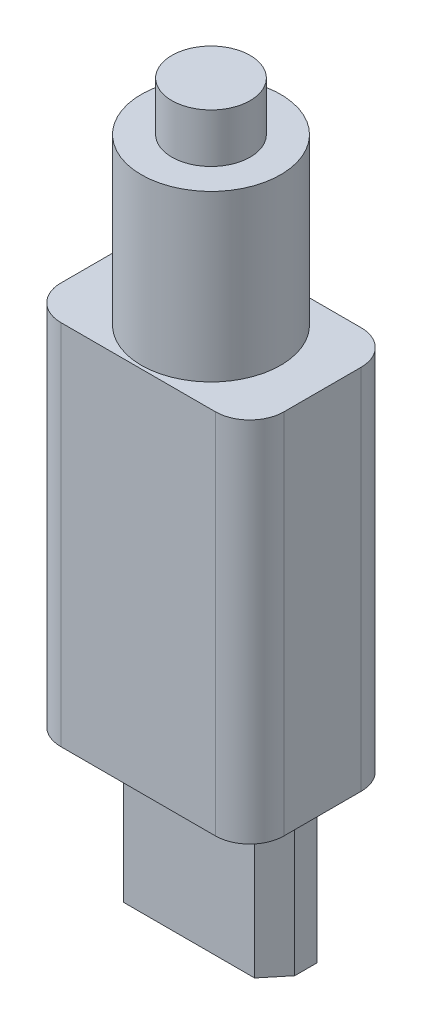
ISO-10303-21;
HEADER;
FILE_DESCRIPTION(('STEP AP214'),'2;1');
FILE_NAME('part.step','',(''),(''),'','','');
FILE_SCHEMA(('AUTOMOTIVE_DESIGN { 1 0 10303 214 1 1 1 1 }'));
ENDSEC;
DATA;
#1=APPLICATION_CONTEXT('core data for automotive mechanical design processes');
#2=APPLICATION_PROTOCOL_DEFINITION('international standard','automotive_design',2000,#1);
#3=PRODUCT_CONTEXT('',#1,'mechanical');
#4=PRODUCT('Part','Part','',(#3));
#5=PRODUCT_RELATED_PRODUCT_CATEGORY('part','',(#4));
#6=PRODUCT_DEFINITION_FORMATION('','',#4);
#7=PRODUCT_DEFINITION_CONTEXT('part definition',#1,'design');
#8=PRODUCT_DEFINITION('design','',#6,#7);
#9=PRODUCT_DEFINITION_SHAPE('','',#8);
#10=(LENGTH_UNIT() NAMED_UNIT(*) SI_UNIT(.MILLI.,.METRE.));
#11=(NAMED_UNIT(*) PLANE_ANGLE_UNIT() SI_UNIT($,.RADIAN.));
#12=(NAMED_UNIT(*) SI_UNIT($,.STERADIAN.) SOLID_ANGLE_UNIT());
#13=UNCERTAINTY_MEASURE_WITH_UNIT(LENGTH_MEASURE(1.E-05),#10,'distance_accuracy_value','');
#14=(GEOMETRIC_REPRESENTATION_CONTEXT(3) GLOBAL_UNCERTAINTY_ASSIGNED_CONTEXT((#13)) GLOBAL_UNIT_ASSIGNED_CONTEXT((#10,
#11,#12)) REPRESENTATION_CONTEXT('',''));
#15=CARTESIAN_POINT('',(0.,0.,0.));
#16=DIRECTION('',(0.,0.,1.));
#17=DIRECTION('',(1.,0.,0.));
#18=AXIS2_PLACEMENT_3D('',#15,#16,#17);
#19=CARTESIAN_POINT('',(3.42,6.3,0.));
#20=DIRECTION('',(-1.,0.,0.));
#21=DIRECTION('',(0.,0.,1.));
#22=AXIS2_PLACEMENT_3D('',#19,#20,#21);
#23=PLANE('',#22);
#24=DIRECTION('',(0.,0.,-1.));
#25=VECTOR('',#24,1.);
#26=CARTESIAN_POINT('',(3.42,0.,0.));
#27=LINE('',#26,#25);
#28=CARTESIAN_POINT('',(3.42,0.,0.));
#29=VERTEX_POINT('',#28);
#30=CARTESIAN_POINT('',(3.42,0.,-0.9));
#31=VERTEX_POINT('',#30);
#32=EDGE_CURVE('E171',#29,#31,#27,.T.);
#33=ORIENTED_EDGE('',*,*,#32,.T.);
#34=DIRECTION('',(0.,-1.,0.));
#35=VECTOR('',#34,1.);
#36=CARTESIAN_POINT('',(3.42,6.3,-0.9));
#37=LINE('',#36,#35);
#38=CARTESIAN_POINT('',(3.42,6.3,-0.9));
#39=VERTEX_POINT('',#38);
#40=EDGE_CURVE('E145',#39,#31,#37,.T.);
#41=ORIENTED_EDGE('',*,*,#40,.F.);
#42=DIRECTION('',(0.,0.,-1.));
#43=VECTOR('',#42,1.);
#44=CARTESIAN_POINT('',(3.42,6.3,0.));
#45=LINE('',#44,#43);
#46=CARTESIAN_POINT('',(3.42,6.3,0.));
#47=VERTEX_POINT('',#46);
#48=EDGE_CURVE('E139',#47,#39,#45,.T.);
#49=ORIENTED_EDGE('',*,*,#48,.F.);
#50=DIRECTION('',(0.,-1.,0.));
#51=VECTOR('',#50,1.);
#52=CARTESIAN_POINT('',(3.42,6.3,0.));
#53=LINE('',#52,#51);
#54=EDGE_CURVE('E142',#47,#29,#53,.T.);
#55=ORIENTED_EDGE('',*,*,#54,.T.);
#56=EDGE_LOOP('',(#33,#41,#49,#55));
#57=FACE_BOUND('',#56,.T.);
#58=ADVANCED_FACE('F33',(#57),#23,.F.);
#59=CARTESIAN_POINT('',(-3.42,6.3,-0.9));
#60=DIRECTION('',(0.,0.,1.));
#61=DIRECTION('',(1.,0.,0.));
#62=AXIS2_PLACEMENT_3D('',#59,#60,#61);
#63=PLANE('',#62);
#64=DIRECTION('',(-1.,0.,0.));
#65=VECTOR('',#64,1.);
#66=CARTESIAN_POINT('',(-3.42,0.,-0.9));
#67=LINE('',#66,#65);
#68=CARTESIAN_POINT('',(-3.42,0.,-0.9));
#69=VERTEX_POINT('',#68);
#70=EDGE_CURVE('E173',#31,#69,#67,.T.);
#71=ORIENTED_EDGE('',*,*,#70,.T.);
#72=DIRECTION('',(0.,-1.,0.));
#73=VECTOR('',#72,1.);
#74=CARTESIAN_POINT('',(-3.42,6.3,-0.9));
#75=LINE('',#74,#73);
#76=CARTESIAN_POINT('',(-3.42,6.3,-0.9));
#77=VERTEX_POINT('',#76);
#78=EDGE_CURVE('E190',#77,#69,#75,.T.);
#79=ORIENTED_EDGE('',*,*,#78,.F.);
#80=DIRECTION('',(-1.,0.,0.));
#81=VECTOR('',#80,1.);
#82=CARTESIAN_POINT('',(-3.42,6.3,-0.9));
#83=LINE('',#82,#81);
#84=EDGE_CURVE('E149',#39,#77,#83,.T.);
#85=ORIENTED_EDGE('',*,*,#84,.F.);
#86=ORIENTED_EDGE('',*,*,#40,.T.);
#87=EDGE_LOOP('',(#71,#79,#85,#86));
#88=FACE_BOUND('',#87,.T.);
#89=ADVANCED_FACE('F268',(#88),#63,.F.);
#90=CARTESIAN_POINT('',(-3.42,6.3,0.));
#91=DIRECTION('',(1.,0.,0.));
#92=DIRECTION('',(0.,0.,-1.));
#93=AXIS2_PLACEMENT_3D('',#90,#91,#92);
#94=PLANE('',#93);
#95=DIRECTION('',(0.,0.,1.));
#96=VECTOR('',#95,1.);
#97=CARTESIAN_POINT('',(-3.42,0.,0.));
#98=LINE('',#97,#96);
#99=CARTESIAN_POINT('',(-3.42,0.,0.));
#100=VERTEX_POINT('',#99);
#101=EDGE_CURVE('E176',#69,#100,#98,.T.);
#102=ORIENTED_EDGE('',*,*,#101,.T.);
#103=DIRECTION('',(0.,-1.,0.));
#104=VECTOR('',#103,1.);
#105=CARTESIAN_POINT('',(-3.42,6.3,0.));
#106=LINE('',#105,#104);
#107=CARTESIAN_POINT('',(-3.42,6.3,0.));
#108=VERTEX_POINT('',#107);
#109=EDGE_CURVE('E187',#108,#100,#106,.T.);
#110=ORIENTED_EDGE('',*,*,#109,.F.);
#111=DIRECTION('',(0.,0.,1.));
#112=VECTOR('',#111,1.);
#113=CARTESIAN_POINT('',(-3.42,6.3,0.));
#114=LINE('',#113,#112);
#115=EDGE_CURVE('E254',#77,#108,#114,.T.);
#116=ORIENTED_EDGE('',*,*,#115,.F.);
#117=ORIENTED_EDGE('',*,*,#78,.T.);
#118=EDGE_LOOP('',(#102,#110,#116,#117));
#119=FACE_BOUND('',#118,.T.);
#120=ADVANCED_FACE('F270',(#119),#94,.F.);
#121=CARTESIAN_POINT('',(-3.42,6.3,0.));
#122=DIRECTION('',(0.772425485990959,0.,-0.635105399592565));
#123=DIRECTION('',(-0.635105399592565,0.,-0.772425485990958));
#124=AXIS2_PLACEMENT_3D('',#121,#122,#123);
#125=PLANE('',#124);
#126=DIRECTION('',(0.635105399592565,0.,0.772425485990958));
#127=VECTOR('',#126,1.);
#128=CARTESIAN_POINT('',(-3.42,0.,0.));
#129=LINE('',#128,#127);
#130=CARTESIAN_POINT('',(-2.68,0.,0.9));
#131=VERTEX_POINT('',#130);
#132=EDGE_CURVE('E178',#100,#131,#129,.T.);
#133=ORIENTED_EDGE('',*,*,#132,.T.);
#134=DIRECTION('',(0.,-1.,0.));
#135=VECTOR('',#134,1.);
#136=CARTESIAN_POINT('',(-2.68,6.3,0.9));
#137=LINE('',#136,#135);
#138=CARTESIAN_POINT('',(-2.68,6.3,0.9));
#139=VERTEX_POINT('',#138);
#140=EDGE_CURVE('E184',#139,#131,#137,.T.);
#141=ORIENTED_EDGE('',*,*,#140,.F.);
#142=DIRECTION('',(0.635105399592565,0.,0.772425485990958));
#143=VECTOR('',#142,1.);
#144=CARTESIAN_POINT('',(-3.42,6.3,0.));
#145=LINE('',#144,#143);
#146=EDGE_CURVE('E167',#108,#139,#145,.T.);
#147=ORIENTED_EDGE('',*,*,#146,.F.);
#148=ORIENTED_EDGE('',*,*,#109,.T.);
#149=EDGE_LOOP('',(#133,#141,#147,#148));
#150=FACE_BOUND('',#149,.T.);
#151=ADVANCED_FACE('F259',(#150),#125,.F.);
#152=CARTESIAN_POINT('',(-2.68,6.3,0.9));
#153=DIRECTION('',(0.,0.,-1.));
#154=DIRECTION('',(-1.,0.,0.));
#155=AXIS2_PLACEMENT_3D('',#152,#153,#154);
#156=PLANE('',#155);
#157=DIRECTION('',(1.,0.,0.));
#158=VECTOR('',#157,1.);
#159=CARTESIAN_POINT('',(-2.68,0.,0.9));
#160=LINE('',#159,#158);
#161=CARTESIAN_POINT('',(2.68,0.,0.899999999999999));
#162=VERTEX_POINT('',#161);
#163=EDGE_CURVE('E180',#131,#162,#160,.T.);
#164=ORIENTED_EDGE('',*,*,#163,.T.);
#165=DIRECTION('',(0.,-1.,0.));
#166=VECTOR('',#165,1.);
#167=CARTESIAN_POINT('',(2.68,6.3,0.899999999999999));
#168=LINE('',#167,#166);
#169=CARTESIAN_POINT('',(2.68,6.3,0.899999999999999));
#170=VERTEX_POINT('',#169);
#171=EDGE_CURVE('E159',#170,#162,#168,.T.);
#172=ORIENTED_EDGE('',*,*,#171,.F.);
#173=DIRECTION('',(1.,0.,0.));
#174=VECTOR('',#173,1.);
#175=CARTESIAN_POINT('',(-2.68,6.3,0.9));
#176=LINE('',#175,#174);
#177=EDGE_CURVE('E165',#139,#170,#176,.T.);
#178=ORIENTED_EDGE('',*,*,#177,.F.);
#179=ORIENTED_EDGE('',*,*,#140,.T.);
#180=EDGE_LOOP('',(#164,#172,#178,#179));
#181=FACE_BOUND('',#180,.T.);
#182=ADVANCED_FACE('F263',(#181),#156,.F.);
#183=CARTESIAN_POINT('',(2.68,6.3,0.899999999999999));
#184=DIRECTION('',(-0.772425485990958,0.,-0.635105399592566));
#185=DIRECTION('',(-0.635105399592566,0.,0.772425485990958));
#186=AXIS2_PLACEMENT_3D('',#183,#184,#185);
#187=PLANE('',#186);
#188=DIRECTION('',(0.635105399592566,0.,-0.772425485990958));
#189=VECTOR('',#188,1.);
#190=CARTESIAN_POINT('',(2.68,0.,0.899999999999999));
#191=LINE('',#190,#189);
#192=EDGE_CURVE('E150',#162,#29,#191,.T.);
#193=ORIENTED_EDGE('',*,*,#192,.T.);
#194=ORIENTED_EDGE('',*,*,#54,.F.);
#195=DIRECTION('',(0.635105399592566,0.,-0.772425485990958));
#196=VECTOR('',#195,1.);
#197=CARTESIAN_POINT('',(2.68,6.3,0.899999999999999));
#198=LINE('',#197,#196);
#199=EDGE_CURVE('E156',#170,#47,#198,.T.);
#200=ORIENTED_EDGE('',*,*,#199,.F.);
#201=ORIENTED_EDGE('',*,*,#171,.T.);
#202=EDGE_LOOP('',(#193,#194,#200,#201));
#203=FACE_BOUND('',#202,.T.);
#204=ADVANCED_FACE('F154',(#203),#187,.F.);
#205=CARTESIAN_POINT('',(0.,0.,0.));
#206=DIRECTION('',(0.,-1.,0.));
#207=DIRECTION('',(0.,0.,-1.));
#208=AXIS2_PLACEMENT_3D('',#205,#206,#207);
#209=PLANE('',#208);
#210=ORIENTED_EDGE('',*,*,#32,.F.);
#211=ORIENTED_EDGE('',*,*,#192,.F.);
#212=ORIENTED_EDGE('',*,*,#163,.F.);
#213=ORIENTED_EDGE('',*,*,#132,.F.);
#214=ORIENTED_EDGE('',*,*,#101,.F.);
#215=ORIENTED_EDGE('',*,*,#70,.F.);
#216=EDGE_LOOP('',(#210,#211,#212,#213,#214,#215));
#217=FACE_BOUND('',#216,.T.);
#218=ADVANCED_FACE('F265',(#217),#209,.T.);
#219=CARTESIAN_POINT('',(4.555,21.3,2.975));
#220=DIRECTION('',(-1.,0.,0.));
#221=DIRECTION('',(0.,0.,1.));
#222=AXIS2_PLACEMENT_3D('',#219,#220,#221);
#223=PLANE('',#222);
#224=DIRECTION('',(0.,0.,-1.));
#225=VECTOR('',#224,1.);
#226=CARTESIAN_POINT('',(4.555,6.3,2.975));
#227=LINE('',#226,#225);
#228=CARTESIAN_POINT('',(4.555,6.3,1.575));
#229=VERTEX_POINT('',#228);
#230=CARTESIAN_POINT('',(4.555,6.3,-1.575));
#231=VERTEX_POINT('',#230);
#232=EDGE_CURVE('E243',#229,#231,#227,.T.);
#233=ORIENTED_EDGE('',*,*,#232,.T.);
#234=DIRECTION('',(0.,-1.,0.));
#235=VECTOR('',#234,1.);
#236=CARTESIAN_POINT('',(4.555,21.3,-1.575));
#237=LINE('',#236,#235);
#238=CARTESIAN_POINT('',(4.555,21.3,-1.575));
#239=VERTEX_POINT('',#238);
#240=EDGE_CURVE('E210',#231,#239,#237,.F.);
#241=ORIENTED_EDGE('',*,*,#240,.T.);
#242=DIRECTION('',(0.,0.,-1.));
#243=VECTOR('',#242,1.);
#244=CARTESIAN_POINT('',(4.555,21.3,2.975));
#245=LINE('',#244,#243);
#246=CARTESIAN_POINT('',(4.555,21.3,1.575));
#247=VERTEX_POINT('',#246);
#248=EDGE_CURVE('E233',#247,#239,#245,.T.);
#249=ORIENTED_EDGE('',*,*,#248,.F.);
#250=DIRECTION('',(0.,-1.,0.));
#251=VECTOR('',#250,1.);
#252=CARTESIAN_POINT('',(4.555,21.3,1.575));
#253=LINE('',#252,#251);
#254=EDGE_CURVE('E207',#247,#229,#253,.T.);
#255=ORIENTED_EDGE('',*,*,#254,.T.);
#256=EDGE_LOOP('',(#233,#241,#249,#255));
#257=FACE_BOUND('',#256,.T.);
#258=ADVANCED_FACE('F316',(#257),#223,.F.);
#259=CARTESIAN_POINT('',(-4.555,21.3,-2.975));
#260=DIRECTION('',(0.,0.,1.));
#261=DIRECTION('',(1.,0.,0.));
#262=AXIS2_PLACEMENT_3D('',#259,#260,#261);
#263=PLANE('',#262);
#264=DIRECTION('',(-1.,0.,0.));
#265=VECTOR('',#264,1.);
#266=CARTESIAN_POINT('',(-4.555,21.3,-2.975));
#267=LINE('',#266,#265);
#268=CARTESIAN_POINT('',(3.155,21.3,-2.975));
#269=VERTEX_POINT('',#268);
#270=CARTESIAN_POINT('',(-3.155,21.3,-2.975));
#271=VERTEX_POINT('',#270);
#272=EDGE_CURVE('E236',#269,#271,#267,.T.);
#273=ORIENTED_EDGE('',*,*,#272,.F.);
#274=DIRECTION('',(0.,-1.,0.));
#275=VECTOR('',#274,1.);
#276=CARTESIAN_POINT('',(3.155,21.3,-2.975));
#277=LINE('',#276,#275);
#278=CARTESIAN_POINT('',(3.155,6.3,-2.975));
#279=VERTEX_POINT('',#278);
#280=EDGE_CURVE('E196',#269,#279,#277,.T.);
#281=ORIENTED_EDGE('',*,*,#280,.T.);
#282=DIRECTION('',(-1.,0.,0.));
#283=VECTOR('',#282,1.);
#284=CARTESIAN_POINT('',(-4.555,6.3,-2.975));
#285=LINE('',#284,#283);
#286=CARTESIAN_POINT('',(-3.155,6.3,-2.975));
#287=VERTEX_POINT('',#286);
#288=EDGE_CURVE('E246',#279,#287,#285,.T.);
#289=ORIENTED_EDGE('',*,*,#288,.T.);
#290=DIRECTION('',(0.,-1.,0.));
#291=VECTOR('',#290,1.);
#292=CARTESIAN_POINT('',(-3.155,21.3,-2.975));
#293=LINE('',#292,#291);
#294=EDGE_CURVE('E194',#287,#271,#293,.F.);
#295=ORIENTED_EDGE('',*,*,#294,.T.);
#296=EDGE_LOOP('',(#273,#281,#289,#295));
#297=FACE_BOUND('',#296,.T.);
#298=ADVANCED_FACE('F310',(#297),#263,.F.);
#299=CARTESIAN_POINT('',(-4.555,21.3,2.975));
#300=DIRECTION('',(1.,0.,0.));
#301=DIRECTION('',(0.,0.,-1.));
#302=AXIS2_PLACEMENT_3D('',#299,#300,#301);
#303=PLANE('',#302);
#304=DIRECTION('',(0.,0.,1.));
#305=VECTOR('',#304,1.);
#306=CARTESIAN_POINT('',(-4.555,21.3,2.975));
#307=LINE('',#306,#305);
#308=CARTESIAN_POINT('',(-4.555,21.3,-1.575));
#309=VERTEX_POINT('',#308);
#310=CARTESIAN_POINT('',(-4.555,21.3,1.575));
#311=VERTEX_POINT('',#310);
#312=EDGE_CURVE('E240',#309,#311,#307,.T.);
#313=ORIENTED_EDGE('',*,*,#312,.F.);
#314=DIRECTION('',(0.,-1.,0.));
#315=VECTOR('',#314,1.);
#316=CARTESIAN_POINT('',(-4.555,21.3,-1.575));
#317=LINE('',#316,#315);
#318=CARTESIAN_POINT('',(-4.555,6.3,-1.575));
#319=VERTEX_POINT('',#318);
#320=EDGE_CURVE('E221',#309,#319,#317,.T.);
#321=ORIENTED_EDGE('',*,*,#320,.T.);
#322=DIRECTION('',(0.,0.,1.));
#323=VECTOR('',#322,1.);
#324=CARTESIAN_POINT('',(-4.555,6.3,2.975));
#325=LINE('',#324,#323);
#326=CARTESIAN_POINT('',(-4.555,6.3,1.575));
#327=VERTEX_POINT('',#326);
#328=EDGE_CURVE('E249',#319,#327,#325,.T.);
#329=ORIENTED_EDGE('',*,*,#328,.T.);
#330=DIRECTION('',(0.,-1.,0.));
#331=VECTOR('',#330,1.);
#332=CARTESIAN_POINT('',(-4.555,21.3,1.575));
#333=LINE('',#332,#331);
#334=EDGE_CURVE('E219',#327,#311,#333,.F.);
#335=ORIENTED_EDGE('',*,*,#334,.T.);
#336=EDGE_LOOP('',(#313,#321,#329,#335));
#337=FACE_BOUND('',#336,.T.);
#338=ADVANCED_FACE('F304',(#337),#303,.F.);
#339=CARTESIAN_POINT('',(-4.555,21.3,2.975));
#340=DIRECTION('',(0.,0.,-1.));
#341=DIRECTION('',(-1.,0.,0.));
#342=AXIS2_PLACEMENT_3D('',#339,#340,#341);
#343=PLANE('',#342);
#344=DIRECTION('',(1.,0.,0.));
#345=VECTOR('',#344,1.);
#346=CARTESIAN_POINT('',(-4.555,21.3,2.975));
#347=LINE('',#346,#345);
#348=CARTESIAN_POINT('',(-3.155,21.3,2.975));
#349=VERTEX_POINT('',#348);
#350=CARTESIAN_POINT('',(3.155,21.3,2.975));
#351=VERTEX_POINT('',#350);
#352=EDGE_CURVE('E174',#349,#351,#347,.T.);
#353=ORIENTED_EDGE('',*,*,#352,.F.);
#354=DIRECTION('',(0.,-1.,0.));
#355=VECTOR('',#354,1.);
#356=CARTESIAN_POINT('',(-3.155,21.3,2.975));
#357=LINE('',#356,#355);
#358=CARTESIAN_POINT('',(-3.155,6.3,2.975));
#359=VERTEX_POINT('',#358);
#360=EDGE_CURVE('E37',#349,#359,#357,.T.);
#361=ORIENTED_EDGE('',*,*,#360,.T.);
#362=DIRECTION('',(1.,0.,0.));
#363=VECTOR('',#362,1.);
#364=CARTESIAN_POINT('',(-4.555,6.3,2.975));
#365=LINE('',#364,#363);
#366=CARTESIAN_POINT('',(3.155,6.3,2.975));
#367=VERTEX_POINT('',#366);
#368=EDGE_CURVE('E237',#359,#367,#365,.T.);
#369=ORIENTED_EDGE('',*,*,#368,.T.);
#370=DIRECTION('',(0.,-1.,0.));
#371=VECTOR('',#370,1.);
#372=CARTESIAN_POINT('',(3.155,21.3,2.975));
#373=LINE('',#372,#371);
#374=EDGE_CURVE('E50',#367,#351,#373,.F.);
#375=ORIENTED_EDGE('',*,*,#374,.T.);
#376=EDGE_LOOP('',(#353,#361,#369,#375));
#377=FACE_BOUND('',#376,.T.);
#378=ADVANCED_FACE('F320',(#377),#343,.F.);
#379=CARTESIAN_POINT('',(0.,21.3,0.));
#380=DIRECTION('',(0.,-1.,0.));
#381=DIRECTION('',(0.,0.,-1.));
#382=AXIS2_PLACEMENT_3D('',#379,#380,#381);
#383=PLANE('',#382);
#384=CARTESIAN_POINT('',(0.,21.3,0.));
#385=DIRECTION('',(0.,1.,0.));
#386=DIRECTION('',(0.,0.,1.));
#387=AXIS2_PLACEMENT_3D('',#384,#385,#386);
#388=CIRCLE('',#387,2.845);
#389=CARTESIAN_POINT('',(0.,21.3,2.845));
#390=VERTEX_POINT('',#389);
#391=EDGE_CURVE('E42',#390,#390,#388,.T.);
#392=ORIENTED_EDGE('',*,*,#391,.F.);
#393=EDGE_LOOP('',(#392));
#394=FACE_BOUND('',#393,.T.);
#395=ORIENTED_EDGE('',*,*,#248,.T.);
#396=CARTESIAN_POINT('',(3.155,21.3,-1.575));
#397=DIRECTION('',(0.,-1.,0.));
#398=DIRECTION('',(0.,0.,-1.));
#399=AXIS2_PLACEMENT_3D('',#396,#397,#398);
#400=CIRCLE('',#399,1.4);
#401=EDGE_CURVE('E217',#239,#269,#400,.F.);
#402=ORIENTED_EDGE('',*,*,#401,.T.);
#403=ORIENTED_EDGE('',*,*,#272,.T.);
#404=CARTESIAN_POINT('',(-3.155,21.3,-1.575));
#405=DIRECTION('',(0.,-1.,0.));
#406=DIRECTION('',(0.,0.,-1.));
#407=AXIS2_PLACEMENT_3D('',#404,#405,#406);
#408=CIRCLE('',#407,1.4);
#409=EDGE_CURVE('E215',#271,#309,#408,.F.);
#410=ORIENTED_EDGE('',*,*,#409,.T.);
#411=ORIENTED_EDGE('',*,*,#312,.T.);
#412=CARTESIAN_POINT('',(-3.155,21.3,1.575));
#413=DIRECTION('',(0.,-1.,0.));
#414=DIRECTION('',(0.,0.,-1.));
#415=AXIS2_PLACEMENT_3D('',#412,#413,#414);
#416=CIRCLE('',#415,1.4);
#417=EDGE_CURVE('E57',#311,#349,#416,.F.);
#418=ORIENTED_EDGE('',*,*,#417,.T.);
#419=ORIENTED_EDGE('',*,*,#352,.T.);
#420=CARTESIAN_POINT('',(3.155,21.3,1.575));
#421=DIRECTION('',(0.,-1.,0.));
#422=DIRECTION('',(0.,0.,-1.));
#423=AXIS2_PLACEMENT_3D('',#420,#421,#422);
#424=CIRCLE('',#423,1.4);
#425=EDGE_CURVE('E212',#351,#247,#424,.F.);
#426=ORIENTED_EDGE('',*,*,#425,.T.);
#427=EDGE_LOOP('',(#395,#402,#403,#410,#411,#418,#419,#426));
#428=FACE_BOUND('',#427,.T.);
#429=ADVANCED_FACE('F322',(#394,#428),#383,.F.);
#430=CARTESIAN_POINT('',(0.,6.3,0.));
#431=DIRECTION('',(0.,-1.,0.));
#432=DIRECTION('',(0.,0.,-1.));
#433=AXIS2_PLACEMENT_3D('',#430,#431,#432);
#434=PLANE('',#433);
#435=ORIENTED_EDGE('',*,*,#199,.T.);
#436=ORIENTED_EDGE('',*,*,#48,.T.);
#437=ORIENTED_EDGE('',*,*,#84,.T.);
#438=ORIENTED_EDGE('',*,*,#115,.T.);
#439=ORIENTED_EDGE('',*,*,#146,.T.);
#440=ORIENTED_EDGE('',*,*,#177,.T.);
#441=EDGE_LOOP('',(#435,#436,#437,#438,#439,#440));
#442=FACE_BOUND('',#441,.T.);
#443=ORIENTED_EDGE('',*,*,#288,.F.);
#444=CARTESIAN_POINT('',(3.155,6.3,-1.575));
#445=DIRECTION('',(0.,-1.,0.));
#446=DIRECTION('',(0.,0.,-1.));
#447=AXIS2_PLACEMENT_3D('',#444,#445,#446);
#448=CIRCLE('',#447,1.4);
#449=EDGE_CURVE('E205',#279,#231,#448,.T.);
#450=ORIENTED_EDGE('',*,*,#449,.T.);
#451=ORIENTED_EDGE('',*,*,#232,.F.);
#452=CARTESIAN_POINT('',(3.155,6.3,1.575));
#453=DIRECTION('',(0.,-1.,0.));
#454=DIRECTION('',(0.,0.,-1.));
#455=AXIS2_PLACEMENT_3D('',#452,#453,#454);
#456=CIRCLE('',#455,1.4);
#457=EDGE_CURVE('E199',#229,#367,#456,.T.);
#458=ORIENTED_EDGE('',*,*,#457,.T.);
#459=ORIENTED_EDGE('',*,*,#368,.F.);
#460=CARTESIAN_POINT('',(-3.155,6.3,1.575));
#461=DIRECTION('',(0.,-1.,0.));
#462=DIRECTION('',(0.,0.,-1.));
#463=AXIS2_PLACEMENT_3D('',#460,#461,#462);
#464=CIRCLE('',#463,1.4);
#465=EDGE_CURVE('E201',#359,#327,#464,.T.);
#466=ORIENTED_EDGE('',*,*,#465,.T.);
#467=ORIENTED_EDGE('',*,*,#328,.F.);
#468=CARTESIAN_POINT('',(-3.155,6.3,-1.575));
#469=DIRECTION('',(0.,-1.,0.));
#470=DIRECTION('',(0.,0.,-1.));
#471=AXIS2_PLACEMENT_3D('',#468,#469,#470);
#472=CIRCLE('',#471,1.4);
#473=EDGE_CURVE('E203',#319,#287,#472,.T.);
#474=ORIENTED_EDGE('',*,*,#473,.T.);
#475=EDGE_LOOP('',(#443,#450,#451,#458,#459,#466,#467,#474));
#476=FACE_BOUND('',#475,.T.);
#477=ADVANCED_FACE('F161',(#442,#476),#434,.T.);
#478=CARTESIAN_POINT('',(3.155,21.3,-1.575));
#479=DIRECTION('',(0.,-1.,0.));
#480=DIRECTION('',(0.,0.,-1.));
#481=AXIS2_PLACEMENT_3D('',#478,#479,#480);
#482=CYLINDRICAL_SURFACE('',#481,1.4);
#483=ORIENTED_EDGE('',*,*,#401,.F.);
#484=ORIENTED_EDGE('',*,*,#240,.F.);
#485=ORIENTED_EDGE('',*,*,#449,.F.);
#486=ORIENTED_EDGE('',*,*,#280,.F.);
#487=EDGE_LOOP('',(#483,#484,#485,#486));
#488=FACE_BOUND('',#487,.T.);
#489=ADVANCED_FACE('F284',(#488),#482,.T.);
#490=CARTESIAN_POINT('',(-3.155,21.3,-1.575));
#491=DIRECTION('',(0.,-1.,0.));
#492=DIRECTION('',(0.,0.,-1.));
#493=AXIS2_PLACEMENT_3D('',#490,#491,#492);
#494=CYLINDRICAL_SURFACE('',#493,1.4);
#495=ORIENTED_EDGE('',*,*,#409,.F.);
#496=ORIENTED_EDGE('',*,*,#294,.F.);
#497=ORIENTED_EDGE('',*,*,#473,.F.);
#498=ORIENTED_EDGE('',*,*,#320,.F.);
#499=EDGE_LOOP('',(#495,#496,#497,#498));
#500=FACE_BOUND('',#499,.T.);
#501=ADVANCED_FACE('F287',(#500),#494,.T.);
#502=CARTESIAN_POINT('',(-3.155,21.3,1.575));
#503=DIRECTION('',(0.,-1.,0.));
#504=DIRECTION('',(0.,0.,-1.));
#505=AXIS2_PLACEMENT_3D('',#502,#503,#504);
#506=CYLINDRICAL_SURFACE('',#505,1.4);
#507=ORIENTED_EDGE('',*,*,#417,.F.);
#508=ORIENTED_EDGE('',*,*,#334,.F.);
#509=ORIENTED_EDGE('',*,*,#465,.F.);
#510=ORIENTED_EDGE('',*,*,#360,.F.);
#511=EDGE_LOOP('',(#507,#508,#509,#510));
#512=FACE_BOUND('',#511,.T.);
#513=ADVANCED_FACE('F290',(#512),#506,.T.);
#514=CARTESIAN_POINT('',(3.155,21.3,1.575));
#515=DIRECTION('',(0.,-1.,0.));
#516=DIRECTION('',(0.,0.,-1.));
#517=AXIS2_PLACEMENT_3D('',#514,#515,#516);
#518=CYLINDRICAL_SURFACE('',#517,1.4);
#519=ORIENTED_EDGE('',*,*,#425,.F.);
#520=ORIENTED_EDGE('',*,*,#374,.F.);
#521=ORIENTED_EDGE('',*,*,#457,.F.);
#522=ORIENTED_EDGE('',*,*,#254,.F.);
#523=EDGE_LOOP('',(#519,#520,#521,#522));
#524=FACE_BOUND('',#523,.T.);
#525=ADVANCED_FACE('F35',(#524),#518,.T.);
#526=CARTESIAN_POINT('',(0.,28.04,0.));
#527=DIRECTION('',(0.,-1.,0.));
#528=DIRECTION('',(0.,0.,-1.));
#529=AXIS2_PLACEMENT_3D('',#526,#527,#528);
#530=CYLINDRICAL_SURFACE('',#529,2.845);
#531=CARTESIAN_POINT('',(0.,28.04,0.));
#532=DIRECTION('',(0.,1.,0.));
#533=DIRECTION('',(0.,0.,1.));
#534=AXIS2_PLACEMENT_3D('',#531,#532,#533);
#535=CIRCLE('',#534,2.845);
#536=CARTESIAN_POINT('',(0.,28.04,2.845));
#537=VERTEX_POINT('',#536);
#538=EDGE_CURVE('E232',#537,#537,#535,.T.);
#539=ORIENTED_EDGE('',*,*,#538,.F.);
#540=EDGE_LOOP('',(#539));
#541=FACE_BOUND('',#540,.T.);
#542=ORIENTED_EDGE('',*,*,#391,.T.);
#543=EDGE_LOOP('',(#542));
#544=FACE_BOUND('',#543,.T.);
#545=ADVANCED_FACE('F297',(#541,#544),#530,.T.);
#546=CARTESIAN_POINT('',(0.,28.04,0.));
#547=DIRECTION('',(0.,1.,0.));
#548=DIRECTION('',(0.,0.,1.));
#549=AXIS2_PLACEMENT_3D('',#546,#547,#548);
#550=PLANE('',#549);
#551=CARTESIAN_POINT('',(0.,28.04,0.));
#552=DIRECTION('',(0.,1.,0.));
#553=DIRECTION('',(0.,0.,1.));
#554=AXIS2_PLACEMENT_3D('',#551,#552,#553);
#555=CIRCLE('',#554,1.6);
#556=CARTESIAN_POINT('',(0.,28.04,1.6));
#557=VERTEX_POINT('',#556);
#558=EDGE_CURVE('E11',#557,#557,#555,.T.);
#559=ORIENTED_EDGE('',*,*,#558,.F.);
#560=EDGE_LOOP('',(#559));
#561=FACE_BOUND('',#560,.T.);
#562=ORIENTED_EDGE('',*,*,#538,.T.);
#563=EDGE_LOOP('',(#562));
#564=FACE_BOUND('',#563,.T.);
#565=ADVANCED_FACE('F414',(#561,#564),#550,.T.);
#566=CARTESIAN_POINT('',(0.,30.04,0.));
#567=DIRECTION('',(0.,-1.,0.));
#568=DIRECTION('',(0.,0.,-1.));
#569=AXIS2_PLACEMENT_3D('',#566,#567,#568);
#570=CYLINDRICAL_SURFACE('',#569,1.6);
#571=CARTESIAN_POINT('',(0.,30.04,0.));
#572=DIRECTION('',(0.,1.,0.));
#573=DIRECTION('',(0.,0.,1.));
#574=AXIS2_PLACEMENT_3D('',#571,#572,#573);
#575=CIRCLE('',#574,1.6);
#576=CARTESIAN_POINT('',(0.,30.04,1.6));
#577=VERTEX_POINT('',#576);
#578=EDGE_CURVE('E450',#577,#577,#575,.T.);
#579=ORIENTED_EDGE('',*,*,#578,.F.);
#580=EDGE_LOOP('',(#579));
#581=FACE_BOUND('',#580,.T.);
#582=ORIENTED_EDGE('',*,*,#558,.T.);
#583=EDGE_LOOP('',(#582));
#584=FACE_BOUND('',#583,.T.);
#585=ADVANCED_FACE('F424',(#581,#584),#570,.T.);
#586=CARTESIAN_POINT('',(0.,30.04,0.));
#587=DIRECTION('',(0.,1.,0.));
#588=DIRECTION('',(0.,0.,1.));
#589=AXIS2_PLACEMENT_3D('',#586,#587,#588);
#590=PLANE('',#589);
#591=ORIENTED_EDGE('',*,*,#578,.T.);
#592=EDGE_LOOP('',(#591));
#593=FACE_BOUND('',#592,.T.);
#594=ADVANCED_FACE('F434',(#593),#590,.T.);
#595=CLOSED_SHELL('',(#58,#89,#120,#151,#182,#204,#218,#258,#298,#338,#378,#429,#477,#489,#501,
#513,#525,#545,#565,#585,#594));
#596=MANIFOLD_SOLID_BREP('B2',#595);
#597=ADVANCED_BREP_SHAPE_REPRESENTATION('',(#18,#596),#14);
#598=SHAPE_DEFINITION_REPRESENTATION(#9,#597);
ENDSEC;
END-ISO-10303-21;
